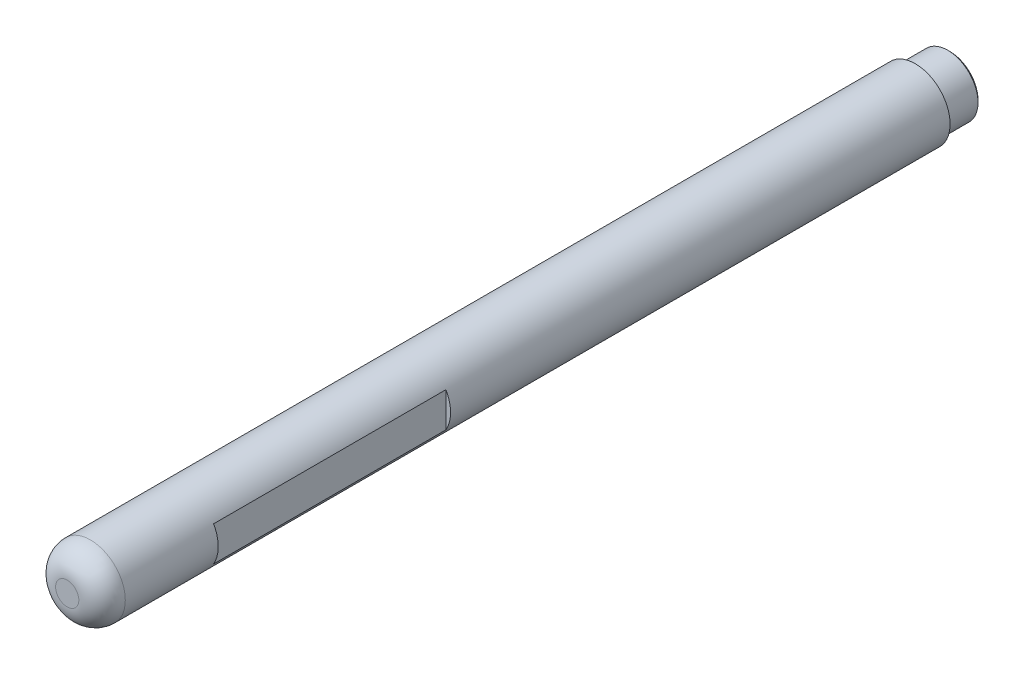
ISO-10303-21;
HEADER;
FILE_DESCRIPTION(('STEP AP214'),'2;1');
FILE_NAME('part.step','',(''),(''),'','','');
FILE_SCHEMA(('AUTOMOTIVE_DESIGN { 1 0 10303 214 1 1 1 1 }'));
ENDSEC;
DATA;
#1=APPLICATION_CONTEXT('core data for automotive mechanical design processes');
#2=APPLICATION_PROTOCOL_DEFINITION('international standard','automotive_design',2000,#1);
#3=PRODUCT_CONTEXT('',#1,'mechanical');
#4=PRODUCT('Part','Part','',(#3));
#5=PRODUCT_RELATED_PRODUCT_CATEGORY('part','',(#4));
#6=PRODUCT_DEFINITION_FORMATION('','',#4);
#7=PRODUCT_DEFINITION_CONTEXT('part definition',#1,'design');
#8=PRODUCT_DEFINITION('design','',#6,#7);
#9=PRODUCT_DEFINITION_SHAPE('','',#8);
#10=(LENGTH_UNIT() NAMED_UNIT(*) SI_UNIT(.MILLI.,.METRE.));
#11=(NAMED_UNIT(*) PLANE_ANGLE_UNIT() SI_UNIT($,.RADIAN.));
#12=(NAMED_UNIT(*) SI_UNIT($,.STERADIAN.) SOLID_ANGLE_UNIT());
#13=UNCERTAINTY_MEASURE_WITH_UNIT(LENGTH_MEASURE(1.E-05),#10,'distance_accuracy_value','');
#14=(GEOMETRIC_REPRESENTATION_CONTEXT(3) GLOBAL_UNCERTAINTY_ASSIGNED_CONTEXT((#13)) GLOBAL_UNIT_ASSIGNED_CONTEXT((#10,
#11,#12)) REPRESENTATION_CONTEXT('',''));
#15=CARTESIAN_POINT('',(0.,0.,0.));
#16=DIRECTION('',(0.,0.,1.));
#17=DIRECTION('',(1.,0.,0.));
#18=AXIS2_PLACEMENT_3D('',#15,#16,#17);
#19=CARTESIAN_POINT('',(0.,0.,95.));
#20=DIRECTION('',(0.,0.,-1.));
#21=DIRECTION('',(-1.,0.,0.));
#22=AXIS2_PLACEMENT_3D('',#19,#20,#21);
#23=CYLINDRICAL_SURFACE('',#22,7.5);
#24=CARTESIAN_POINT('',(0.,0.,70.));
#25=DIRECTION('',(0.,0.,1.));
#26=DIRECTION('',(1.,0.,0.));
#27=AXIS2_PLACEMENT_3D('',#24,#25,#26);
#28=CIRCLE('',#27,7.5);
#29=CARTESIAN_POINT('',(6.5,-3.74165738677394,70.));
#30=VERTEX_POINT('',#29);
#31=CARTESIAN_POINT('',(6.5,3.74165738677394,70.));
#32=VERTEX_POINT('',#31);
#33=EDGE_CURVE('E11',#30,#32,#28,.T.);
#34=ORIENTED_EDGE('',*,*,#33,.T.);
#35=DIRECTION('',(0.,0.,-1.));
#36=VECTOR('',#35,1.);
#37=CARTESIAN_POINT('',(6.5,3.74165738677394,95.));
#38=LINE('',#37,#36);
#39=CARTESIAN_POINT('',(6.5,3.74165738677394,20.));
#40=VERTEX_POINT('',#39);
#41=EDGE_CURVE('E58',#32,#40,#38,.T.);
#42=ORIENTED_EDGE('',*,*,#41,.T.);
#43=CARTESIAN_POINT('',(0.,0.,20.));
#44=DIRECTION('',(0.,0.,-1.));
#45=DIRECTION('',(-1.,0.,0.));
#46=AXIS2_PLACEMENT_3D('',#43,#44,#45);
#47=CIRCLE('',#46,7.5);
#48=CARTESIAN_POINT('',(6.5,-3.74165738677394,20.));
#49=VERTEX_POINT('',#48);
#50=EDGE_CURVE('E76',#40,#49,#47,.T.);
#51=ORIENTED_EDGE('',*,*,#50,.T.);
#52=DIRECTION('',(0.,0.,-1.));
#53=VECTOR('',#52,1.);
#54=CARTESIAN_POINT('',(6.5,-3.74165738677394,95.));
#55=LINE('',#54,#53);
#56=EDGE_CURVE('E84',#49,#30,#55,.F.);
#57=ORIENTED_EDGE('',*,*,#56,.T.);
#58=EDGE_LOOP('',(#34,#42,#51,#57));
#59=FACE_BOUND('',#58,.T.);
#60=CARTESIAN_POINT('',(0.,0.,90.));
#61=DIRECTION('',(0.,0.,1.));
#62=DIRECTION('',(1.,0.,0.));
#63=AXIS2_PLACEMENT_3D('',#60,#61,#62);
#64=CIRCLE('',#63,7.5);
#65=CARTESIAN_POINT('',(7.5,0.,90.));
#66=VERTEX_POINT('',#65);
#67=EDGE_CURVE('E103',#66,#66,#64,.F.);
#68=ORIENTED_EDGE('',*,*,#67,.T.);
#69=EDGE_LOOP('',(#68));
#70=FACE_BOUND('',#69,.T.);
#71=CARTESIAN_POINT('',(0.,0.,-87.5));
#72=DIRECTION('',(0.,0.,-1.));
#73=DIRECTION('',(-1.,0.,0.));
#74=AXIS2_PLACEMENT_3D('',#71,#72,#73);
#75=CIRCLE('',#74,7.5);
#76=CARTESIAN_POINT('',(-7.5,0.,-87.5));
#77=VERTEX_POINT('',#76);
#78=EDGE_CURVE('E110',#77,#77,#75,.T.);
#79=ORIENTED_EDGE('',*,*,#78,.F.);
#80=EDGE_LOOP('',(#79));
#81=FACE_BOUND('',#80,.T.);
#82=ADVANCED_FACE('F51',(#59,#70,#81),#23,.T.);
#83=CARTESIAN_POINT('',(0.,0.,95.));
#84=DIRECTION('',(0.,0.,1.));
#85=DIRECTION('',(1.,0.,0.));
#86=AXIS2_PLACEMENT_3D('',#83,#84,#85);
#87=PLANE('',#86);
#88=CARTESIAN_POINT('',(0.,0.,95.));
#89=DIRECTION('',(0.,0.,1.));
#90=DIRECTION('',(1.,0.,0.));
#91=AXIS2_PLACEMENT_3D('',#88,#89,#90);
#92=CIRCLE('',#91,2.5);
#93=CARTESIAN_POINT('',(2.5,0.,95.));
#94=VERTEX_POINT('',#93);
#95=EDGE_CURVE('E104',#94,#94,#92,.T.);
#96=ORIENTED_EDGE('',*,*,#95,.T.);
#97=EDGE_LOOP('',(#96));
#98=FACE_BOUND('',#97,.T.);
#99=ADVANCED_FACE('F131',(#98),#87,.T.);
#100=CARTESIAN_POINT('',(0.,0.,-87.5));
#101=DIRECTION('',(0.,0.,-1.));
#102=DIRECTION('',(-1.,0.,0.));
#103=AXIS2_PLACEMENT_3D('',#100,#101,#102);
#104=CYLINDRICAL_SURFACE('',#103,6.5);
#105=CARTESIAN_POINT('',(0.,0.,-94.5));
#106=DIRECTION('',(0.,0.,1.));
#107=DIRECTION('',(1.,0.,0.));
#108=AXIS2_PLACEMENT_3D('',#105,#106,#107);
#109=CIRCLE('',#108,6.5);
#110=CARTESIAN_POINT('',(6.5,0.,-94.5));
#111=VERTEX_POINT('',#110);
#112=EDGE_CURVE('E81',#111,#111,#109,.T.);
#113=ORIENTED_EDGE('',*,*,#112,.T.);
#114=EDGE_LOOP('',(#113));
#115=FACE_BOUND('',#114,.T.);
#116=CARTESIAN_POINT('',(0.,0.,-87.5));
#117=DIRECTION('',(0.,0.,-1.));
#118=DIRECTION('',(-1.,0.,0.));
#119=AXIS2_PLACEMENT_3D('',#116,#117,#118);
#120=CIRCLE('',#119,6.5);
#121=CARTESIAN_POINT('',(-6.5,0.,-87.5));
#122=VERTEX_POINT('',#121);
#123=EDGE_CURVE('E109',#122,#122,#120,.T.);
#124=ORIENTED_EDGE('',*,*,#123,.T.);
#125=EDGE_LOOP('',(#124));
#126=FACE_BOUND('',#125,.T.);
#127=ADVANCED_FACE('F136',(#115,#126),#104,.T.);
#128=CARTESIAN_POINT('',(0.,0.,-87.5));
#129=DIRECTION('',(0.,0.,-1.));
#130=DIRECTION('',(-1.,0.,0.));
#131=AXIS2_PLACEMENT_3D('',#128,#129,#130);
#132=PLANE('',#131);
#133=ORIENTED_EDGE('',*,*,#123,.F.);
#134=EDGE_LOOP('',(#133));
#135=FACE_BOUND('',#134,.T.);
#136=ORIENTED_EDGE('',*,*,#78,.T.);
#137=EDGE_LOOP('',(#136));
#138=FACE_BOUND('',#137,.T.);
#139=ADVANCED_FACE('F148',(#135,#138),#132,.T.);
#140=CARTESIAN_POINT('',(0.,0.,-95.));
#141=DIRECTION('',(0.,0.,1.));
#142=DIRECTION('',(1.,0.,0.));
#143=AXIS2_PLACEMENT_3D('',#140,#141,#142);
#144=PLANE('',#143);
#145=CARTESIAN_POINT('',(0.,0.,-95.));
#146=DIRECTION('',(0.,0.,1.));
#147=DIRECTION('',(1.,0.,0.));
#148=AXIS2_PLACEMENT_3D('',#145,#146,#147);
#149=CIRCLE('',#148,6.);
#150=CARTESIAN_POINT('',(6.,0.,-95.));
#151=VERTEX_POINT('',#150);
#152=EDGE_CURVE('E96',#151,#151,#149,.F.);
#153=ORIENTED_EDGE('',*,*,#152,.T.);
#154=EDGE_LOOP('',(#153));
#155=FACE_BOUND('',#154,.T.);
#156=CARTESIAN_POINT('',(0.,0.,-95.));
#157=DIRECTION('',(0.,0.,-1.));
#158=DIRECTION('',(-1.,0.,0.));
#159=AXIS2_PLACEMENT_3D('',#156,#157,#158);
#160=CIRCLE('',#159,2.5);
#161=CARTESIAN_POINT('',(-2.5,0.,-95.));
#162=VERTEX_POINT('',#161);
#163=EDGE_CURVE('E116',#162,#162,#160,.T.);
#164=ORIENTED_EDGE('',*,*,#163,.F.);
#165=EDGE_LOOP('',(#164));
#166=FACE_BOUND('',#165,.T.);
#167=ADVANCED_FACE('F139',(#155,#166),#144,.F.);
#168=CARTESIAN_POINT('',(0.,0.,90.));
#169=DIRECTION('',(0.,0.,1.));
#170=DIRECTION('',(1.,0.,0.));
#171=AXIS2_PLACEMENT_3D('',#168,#169,#170);
#172=DEGENERATE_TOROIDAL_SURFACE('',#171,2.5,5.,.T.);
#173=ORIENTED_EDGE('',*,*,#67,.F.);
#174=EDGE_LOOP('',(#173));
#175=FACE_BOUND('',#174,.T.);
#176=ORIENTED_EDGE('',*,*,#95,.F.);
#177=EDGE_LOOP('',(#176));
#178=FACE_BOUND('',#177,.T.);
#179=ADVANCED_FACE('F142',(#175,#178),#172,.T.);
#180=CARTESIAN_POINT('',(0.,0.,-79.5021515475689));
#181=DIRECTION('',(0.,0.,-1.));
#182=DIRECTION('',(-1.,0.,0.));
#183=AXIS2_PLACEMENT_3D('',#180,#181,#182);
#184=CONICAL_SURFACE('',#183,2.5,1.02974425867665);
#185=CARTESIAN_POINT('',(0.,0.,-78.));
#186=VERTEX_POINT('',#185);
#187=VERTEX_LOOP('',#186);
#188=FACE_BOUND('',#187,.T.);
#189=CARTESIAN_POINT('',(0.,0.,-79.5021515475689));
#190=DIRECTION('',(0.,0.,-1.));
#191=DIRECTION('',(-1.,0.,0.));
#192=AXIS2_PLACEMENT_3D('',#189,#190,#191);
#193=CIRCLE('',#192,2.5);
#194=CARTESIAN_POINT('',(-2.5,0.,-79.5021515475689));
#195=VERTEX_POINT('',#194);
#196=EDGE_CURVE('E113',#195,#195,#193,.T.);
#197=ORIENTED_EDGE('',*,*,#196,.T.);
#198=EDGE_LOOP('',(#197));
#199=FACE_BOUND('',#198,.T.);
#200=ADVANCED_FACE('F141',(#188,#199),#184,.F.);
#201=CARTESIAN_POINT('',(0.,0.,-95.));
#202=DIRECTION('',(0.,0.,-1.));
#203=DIRECTION('',(-1.,0.,0.));
#204=AXIS2_PLACEMENT_3D('',#201,#202,#203);
#205=CYLINDRICAL_SURFACE('',#204,2.5);
#206=ORIENTED_EDGE('',*,*,#196,.F.);
#207=EDGE_LOOP('',(#206));
#208=FACE_BOUND('',#207,.T.);
#209=ORIENTED_EDGE('',*,*,#163,.T.);
#210=EDGE_LOOP('',(#209));
#211=FACE_BOUND('',#210,.T.);
#212=ADVANCED_FACE('F126',(#208,#211),#205,.F.);
#213=CARTESIAN_POINT('',(0.,0.,-95.));
#214=DIRECTION('',(0.,0.,1.));
#215=DIRECTION('',(1.,0.,0.));
#216=AXIS2_PLACEMENT_3D('',#213,#214,#215);
#217=CONICAL_SURFACE('',#216,6.,0.785398163397428);
#218=ORIENTED_EDGE('',*,*,#112,.F.);
#219=EDGE_LOOP('',(#218));
#220=FACE_BOUND('',#219,.T.);
#221=ORIENTED_EDGE('',*,*,#152,.F.);
#222=EDGE_LOOP('',(#221));
#223=FACE_BOUND('',#222,.T.);
#224=ADVANCED_FACE('F53',(#220,#223),#217,.T.);
#225=CARTESIAN_POINT('',(7.5,-7.5,70.));
#226=DIRECTION('',(0.,0.,1.));
#227=DIRECTION('',(1.,0.,0.));
#228=AXIS2_PLACEMENT_3D('',#225,#226,#227);
#229=PLANE('',#228);
#230=ORIENTED_EDGE('',*,*,#33,.F.);
#231=DIRECTION('',(0.,1.,0.));
#232=VECTOR('',#231,1.);
#233=CARTESIAN_POINT('',(6.5,-7.5,70.));
#234=LINE('',#233,#232);
#235=EDGE_CURVE('E91',#30,#32,#234,.T.);
#236=ORIENTED_EDGE('',*,*,#235,.T.);
#237=EDGE_LOOP('',(#230,#236));
#238=FACE_BOUND('',#237,.T.);
#239=ADVANCED_FACE('F119',(#238),#229,.F.);
#240=CARTESIAN_POINT('',(6.5,-7.5,70.));
#241=DIRECTION('',(-1.,0.,0.));
#242=DIRECTION('',(0.,0.,1.));
#243=AXIS2_PLACEMENT_3D('',#240,#241,#242);
#244=PLANE('',#243);
#245=ORIENTED_EDGE('',*,*,#235,.F.);
#246=ORIENTED_EDGE('',*,*,#56,.F.);
#247=DIRECTION('',(0.,1.,0.));
#248=VECTOR('',#247,1.);
#249=CARTESIAN_POINT('',(6.5,-7.5,20.));
#250=LINE('',#249,#248);
#251=EDGE_CURVE('E66',#49,#40,#250,.T.);
#252=ORIENTED_EDGE('',*,*,#251,.T.);
#253=ORIENTED_EDGE('',*,*,#41,.F.);
#254=EDGE_LOOP('',(#245,#246,#252,#253));
#255=FACE_BOUND('',#254,.T.);
#256=ADVANCED_FACE('F88',(#255),#244,.F.);
#257=CARTESIAN_POINT('',(7.5,-7.5,20.));
#258=DIRECTION('',(0.,0.,-1.));
#259=DIRECTION('',(-1.,0.,0.));
#260=AXIS2_PLACEMENT_3D('',#257,#258,#259);
#261=PLANE('',#260);
#262=ORIENTED_EDGE('',*,*,#251,.F.);
#263=ORIENTED_EDGE('',*,*,#50,.F.);
#264=EDGE_LOOP('',(#262,#263));
#265=FACE_BOUND('',#264,.T.);
#266=ADVANCED_FACE('F79',(#265),#261,.F.);
#267=CLOSED_SHELL('',(#82,#99,#127,#139,#167,#179,#200,#212,#224,#239,#256,#266));
#268=MANIFOLD_SOLID_BREP('B2',#267);
#269=ADVANCED_BREP_SHAPE_REPRESENTATION('',(#18,#268),#14);
#270=SHAPE_DEFINITION_REPRESENTATION(#9,#269);
ENDSEC;
END-ISO-10303-21;
